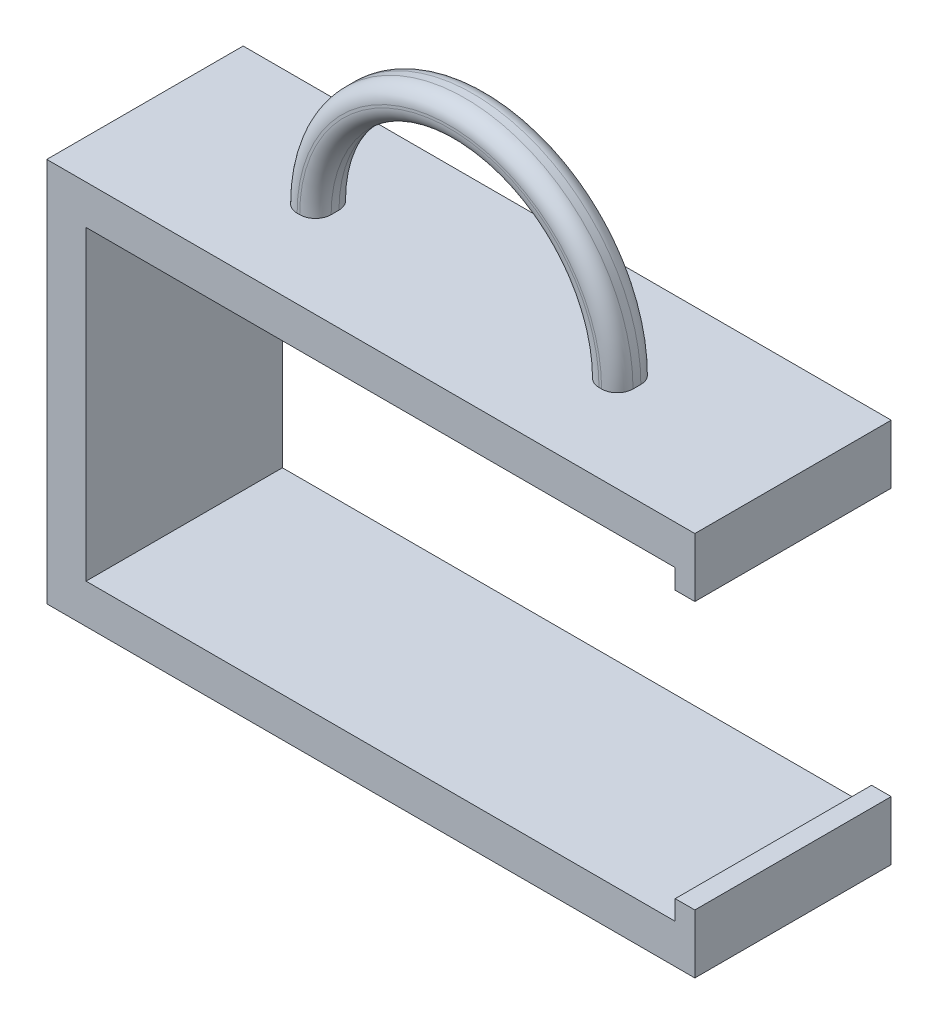
ISO-10303-21;
HEADER;
FILE_DESCRIPTION(('STEP AP214'),'2;1');
FILE_NAME('part.step','',(''),(''),'','','');
FILE_SCHEMA(('AUTOMOTIVE_DESIGN { 1 0 10303 214 1 1 1 1 }'));
ENDSEC;
DATA;
#1=APPLICATION_CONTEXT('core data for automotive mechanical design processes');
#2=APPLICATION_PROTOCOL_DEFINITION('international standard','automotive_design',2000,#1);
#3=PRODUCT_CONTEXT('',#1,'mechanical');
#4=PRODUCT('Part','Part','',(#3));
#5=PRODUCT_RELATED_PRODUCT_CATEGORY('part','',(#4));
#6=PRODUCT_DEFINITION_FORMATION('','',#4);
#7=PRODUCT_DEFINITION_CONTEXT('part definition',#1,'design');
#8=PRODUCT_DEFINITION('design','',#6,#7);
#9=PRODUCT_DEFINITION_SHAPE('','',#8);
#10=(LENGTH_UNIT() NAMED_UNIT(*) SI_UNIT(.MILLI.,.METRE.));
#11=(NAMED_UNIT(*) PLANE_ANGLE_UNIT() SI_UNIT($,.RADIAN.));
#12=(NAMED_UNIT(*) SI_UNIT($,.STERADIAN.) SOLID_ANGLE_UNIT());
#13=UNCERTAINTY_MEASURE_WITH_UNIT(LENGTH_MEASURE(1.E-05),#10,'distance_accuracy_value','');
#14=(GEOMETRIC_REPRESENTATION_CONTEXT(3) GLOBAL_UNCERTAINTY_ASSIGNED_CONTEXT((#13)) GLOBAL_UNIT_ASSIGNED_CONTEXT((#10,
#11,#12)) REPRESENTATION_CONTEXT('',''));
#15=CARTESIAN_POINT('',(0.,0.,0.));
#16=DIRECTION('',(0.,0.,1.));
#17=DIRECTION('',(1.,0.,0.));
#18=AXIS2_PLACEMENT_3D('',#15,#16,#17);
#19=CARTESIAN_POINT('',(41.25,5.,12.5));
#20=DIRECTION('',(-1.,0.,0.));
#21=DIRECTION('',(0.,0.,1.));
#22=AXIS2_PLACEMENT_3D('',#19,#20,#21);
#23=PLANE('',#22);
#24=DIRECTION('',(0.,-1.,0.));
#25=VECTOR('',#24,1.);
#26=CARTESIAN_POINT('',(41.25,5.,-12.5));
#27=LINE('',#26,#25);
#28=CARTESIAN_POINT('',(41.25,7.50000000000001,-12.5));
#29=VERTEX_POINT('',#28);
#30=CARTESIAN_POINT('',(41.25,0.,-12.5));
#31=VERTEX_POINT('',#30);
#32=EDGE_CURVE('E206',#29,#31,#27,.T.);
#33=ORIENTED_EDGE('',*,*,#32,.F.);
#34=DIRECTION('',(0.,0.,1.));
#35=VECTOR('',#34,1.);
#36=CARTESIAN_POINT('',(41.25,7.50000000000001,-46.8656805548792));
#37=LINE('',#36,#35);
#38=CARTESIAN_POINT('',(41.25,7.50000000000001,12.5));
#39=VERTEX_POINT('',#38);
#40=EDGE_CURVE('E198',#29,#39,#37,.T.);
#41=ORIENTED_EDGE('',*,*,#40,.T.);
#42=DIRECTION('',(0.,-1.,0.));
#43=VECTOR('',#42,1.);
#44=CARTESIAN_POINT('',(41.25,5.,12.5));
#45=LINE('',#44,#43);
#46=CARTESIAN_POINT('',(41.25,0.,12.5));
#47=VERTEX_POINT('',#46);
#48=EDGE_CURVE('E353',#39,#47,#45,.T.);
#49=ORIENTED_EDGE('',*,*,#48,.T.);
#50=DIRECTION('',(0.,0.,-1.));
#51=VECTOR('',#50,1.);
#52=CARTESIAN_POINT('',(41.25,0.,12.5));
#53=LINE('',#52,#51);
#54=EDGE_CURVE('E344',#47,#31,#53,.T.);
#55=ORIENTED_EDGE('',*,*,#54,.T.);
#56=EDGE_LOOP('',(#33,#41,#49,#55));
#57=FACE_BOUND('',#56,.T.);
#58=ADVANCED_FACE('F39',(#57),#23,.F.);
#59=CARTESIAN_POINT('',(38.75,5.,-51.5800460593383));
#60=DIRECTION('',(-1.,0.,0.));
#61=DIRECTION('',(0.,-1.,0.));
#62=AXIS2_PLACEMENT_3D('',#59,#60,#61);
#63=PLANE('',#62);
#64=DIRECTION('',(0.,0.,1.));
#65=VECTOR('',#64,1.);
#66=CARTESIAN_POINT('',(38.75,7.50000000000001,-51.5800460593383));
#67=LINE('',#66,#65);
#68=CARTESIAN_POINT('',(38.75,7.50000000000001,-12.5));
#69=VERTEX_POINT('',#68);
#70=CARTESIAN_POINT('',(38.75,7.50000000000001,12.5));
#71=VERTEX_POINT('',#70);
#72=EDGE_CURVE('E210',#69,#71,#67,.T.);
#73=ORIENTED_EDGE('',*,*,#72,.F.);
#74=DIRECTION('',(0.,1.,0.));
#75=VECTOR('',#74,1.);
#76=CARTESIAN_POINT('',(38.75,5.,-12.5));
#77=LINE('',#76,#75);
#78=CARTESIAN_POINT('',(38.75,5.,-12.5));
#79=VERTEX_POINT('',#78);
#80=EDGE_CURVE('E299',#79,#69,#77,.T.);
#81=ORIENTED_EDGE('',*,*,#80,.F.);
#82=DIRECTION('',(0.,0.,1.));
#83=VECTOR('',#82,1.);
#84=CARTESIAN_POINT('',(38.75,5.,-51.5800460593383));
#85=LINE('',#84,#83);
#86=CARTESIAN_POINT('',(38.75,5.,12.5));
#87=VERTEX_POINT('',#86);
#88=EDGE_CURVE('E412',#79,#87,#85,.T.);
#89=ORIENTED_EDGE('',*,*,#88,.T.);
#90=DIRECTION('',(0.,-1.,0.));
#91=VECTOR('',#90,1.);
#92=CARTESIAN_POINT('',(38.75,5.,12.5));
#93=LINE('',#92,#91);
#94=EDGE_CURVE('E403',#71,#87,#93,.T.);
#95=ORIENTED_EDGE('',*,*,#94,.F.);
#96=EDGE_LOOP('',(#73,#81,#89,#95));
#97=FACE_BOUND('',#96,.T.);
#98=ADVANCED_FACE('F435',(#97),#63,.T.);
#99=CARTESIAN_POINT('',(0.,5.,0.));
#100=DIRECTION('',(0.,-1.,0.));
#101=DIRECTION('',(0.,0.,-1.));
#102=AXIS2_PLACEMENT_3D('',#99,#100,#101);
#103=PLANE('',#102);
#104=DIRECTION('',(1.,0.,0.));
#105=VECTOR('',#104,1.);
#106=CARTESIAN_POINT('',(-41.25,5.,12.5));
#107=LINE('',#106,#105);
#108=CARTESIAN_POINT('',(-36.25,5.,12.5));
#109=VERTEX_POINT('',#108);
#110=EDGE_CURVE('E348',#109,#87,#107,.T.);
#111=ORIENTED_EDGE('',*,*,#110,.T.);
#112=ORIENTED_EDGE('',*,*,#88,.F.);
#113=DIRECTION('',(-1.,0.,0.));
#114=VECTOR('',#113,1.);
#115=CARTESIAN_POINT('',(-41.25,5.,-12.5));
#116=LINE('',#115,#114);
#117=CARTESIAN_POINT('',(-36.25,5.,-12.5));
#118=VERTEX_POINT('',#117);
#119=EDGE_CURVE('E345',#79,#118,#116,.T.);
#120=ORIENTED_EDGE('',*,*,#119,.T.);
#121=DIRECTION('',(0.,0.,-1.));
#122=VECTOR('',#121,1.);
#123=CARTESIAN_POINT('',(-36.25,5.,-12.5));
#124=LINE('',#123,#122);
#125=EDGE_CURVE('E323',#109,#118,#124,.T.);
#126=ORIENTED_EDGE('',*,*,#125,.F.);
#127=EDGE_LOOP('',(#111,#112,#120,#126));
#128=FACE_BOUND('',#127,.T.);
#129=ADVANCED_FACE('F446',(#128),#103,.F.);
#130=CARTESIAN_POINT('',(41.25,49.,12.5));
#131=VERTEX_POINT('',#130);
#132=CARTESIAN_POINT('',(41.25,41.5,12.5));
#133=VERTEX_POINT('',#132);
#134=EDGE_CURVE('E196',#131,#133,#45,.T.);
#135=ORIENTED_EDGE('',*,*,#134,.T.);
#136=DIRECTION('',(0.,0.,1.));
#137=VECTOR('',#136,1.);
#138=CARTESIAN_POINT('',(41.25,41.5,-46.8656805548792));
#139=LINE('',#138,#137);
#140=CARTESIAN_POINT('',(41.25,41.5,-12.5));
#141=VERTEX_POINT('',#140);
#142=EDGE_CURVE('E179',#141,#133,#139,.T.);
#143=ORIENTED_EDGE('',*,*,#142,.F.);
#144=CARTESIAN_POINT('',(41.25,49.,-12.5));
#145=VERTEX_POINT('',#144);
#146=EDGE_CURVE('E194',#145,#141,#27,.T.);
#147=ORIENTED_EDGE('',*,*,#146,.F.);
#148=DIRECTION('',(0.,0.,-1.));
#149=VECTOR('',#148,1.);
#150=CARTESIAN_POINT('',(41.25,49.,-12.5));
#151=LINE('',#150,#149);
#152=EDGE_CURVE('E309',#131,#145,#151,.T.);
#153=ORIENTED_EDGE('',*,*,#152,.F.);
#154=EDGE_LOOP('',(#135,#143,#147,#153));
#155=FACE_BOUND('',#154,.T.);
#156=ADVANCED_FACE('F192',(#155),#23,.F.);
#157=CARTESIAN_POINT('',(-41.25,5.,-12.5));
#158=DIRECTION('',(0.,0.,1.));
#159=DIRECTION('',(1.,0.,0.));
#160=AXIS2_PLACEMENT_3D('',#157,#158,#159);
#161=PLANE('',#160);
#162=ORIENTED_EDGE('',*,*,#80,.T.);
#163=DIRECTION('',(-1.,0.,0.));
#164=VECTOR('',#163,1.);
#165=CARTESIAN_POINT('',(36.25,7.50000000000001,-12.5));
#166=LINE('',#165,#164);
#167=EDGE_CURVE('E188',#29,#69,#166,.T.);
#168=ORIENTED_EDGE('',*,*,#167,.F.);
#169=ORIENTED_EDGE('',*,*,#32,.T.);
#170=DIRECTION('',(-1.,0.,0.));
#171=VECTOR('',#170,1.);
#172=CARTESIAN_POINT('',(-41.25,0.,-12.5));
#173=LINE('',#172,#171);
#174=CARTESIAN_POINT('',(-41.25,0.,-12.5));
#175=VERTEX_POINT('',#174);
#176=EDGE_CURVE('E357',#31,#175,#173,.T.);
#177=ORIENTED_EDGE('',*,*,#176,.T.);
#178=DIRECTION('',(0.,-1.,0.));
#179=VECTOR('',#178,1.);
#180=CARTESIAN_POINT('',(-41.25,5.,-12.5));
#181=LINE('',#180,#179);
#182=CARTESIAN_POINT('',(-41.25,49.,-12.5));
#183=VERTEX_POINT('',#182);
#184=EDGE_CURVE('E212',#183,#175,#181,.T.);
#185=ORIENTED_EDGE('',*,*,#184,.F.);
#186=DIRECTION('',(-1.,0.,0.));
#187=VECTOR('',#186,1.);
#188=CARTESIAN_POINT('',(41.25,49.,-12.5));
#189=LINE('',#188,#187);
#190=EDGE_CURVE('E203',#145,#183,#189,.T.);
#191=ORIENTED_EDGE('',*,*,#190,.F.);
#192=ORIENTED_EDGE('',*,*,#146,.T.);
#193=DIRECTION('',(1.,0.,0.));
#194=VECTOR('',#193,1.);
#195=CARTESIAN_POINT('',(36.25,41.5,-12.5));
#196=LINE('',#195,#194);
#197=CARTESIAN_POINT('',(38.75,41.5,-12.5));
#198=VERTEX_POINT('',#197);
#199=EDGE_CURVE('E176',#198,#141,#196,.T.);
#200=ORIENTED_EDGE('',*,*,#199,.F.);
#201=CARTESIAN_POINT('',(38.75,44.,-12.5));
#202=VERTEX_POINT('',#201);
#203=EDGE_CURVE('E406',#198,#202,#77,.T.);
#204=ORIENTED_EDGE('',*,*,#203,.T.);
#205=DIRECTION('',(-1.,0.,0.));
#206=VECTOR('',#205,1.);
#207=CARTESIAN_POINT('',(41.25,44.,-12.5));
#208=LINE('',#207,#206);
#209=CARTESIAN_POINT('',(-36.25,44.,-12.5));
#210=VERTEX_POINT('',#209);
#211=EDGE_CURVE('E278',#202,#210,#208,.T.);
#212=ORIENTED_EDGE('',*,*,#211,.T.);
#213=DIRECTION('',(0.,-1.,0.));
#214=VECTOR('',#213,1.);
#215=CARTESIAN_POINT('',(-36.25,44.,-12.5));
#216=LINE('',#215,#214);
#217=EDGE_CURVE('E333',#210,#118,#216,.T.);
#218=ORIENTED_EDGE('',*,*,#217,.T.);
#219=ORIENTED_EDGE('',*,*,#119,.F.);
#220=EDGE_LOOP('',(#162,#168,#169,#177,#185,#191,#192,#200,#204,#212,#218,#219));
#221=FACE_BOUND('',#220,.T.);
#222=ADVANCED_FACE('F201',(#221),#161,.F.);
#223=CARTESIAN_POINT('',(-41.25,5.,12.5));
#224=DIRECTION('',(1.,0.,0.));
#225=DIRECTION('',(0.,0.,-1.));
#226=AXIS2_PLACEMENT_3D('',#223,#224,#225);
#227=PLANE('',#226);
#228=DIRECTION('',(0.,0.,1.));
#229=VECTOR('',#228,1.);
#230=CARTESIAN_POINT('',(-41.25,0.,12.5));
#231=LINE('',#230,#229);
#232=CARTESIAN_POINT('',(-41.25,0.,12.5));
#233=VERTEX_POINT('',#232);
#234=EDGE_CURVE('E360',#175,#233,#231,.T.);
#235=ORIENTED_EDGE('',*,*,#234,.T.);
#236=DIRECTION('',(0.,-1.,0.));
#237=VECTOR('',#236,1.);
#238=CARTESIAN_POINT('',(-41.25,5.,12.5));
#239=LINE('',#238,#237);
#240=CARTESIAN_POINT('',(-41.25,49.,12.5));
#241=VERTEX_POINT('',#240);
#242=EDGE_CURVE('E367',#241,#233,#239,.T.);
#243=ORIENTED_EDGE('',*,*,#242,.F.);
#244=DIRECTION('',(0.,0.,1.));
#245=VECTOR('',#244,1.);
#246=CARTESIAN_POINT('',(-41.25,49.,-12.5));
#247=LINE('',#246,#245);
#248=EDGE_CURVE('E315',#183,#241,#247,.T.);
#249=ORIENTED_EDGE('',*,*,#248,.F.);
#250=ORIENTED_EDGE('',*,*,#184,.T.);
#251=EDGE_LOOP('',(#235,#243,#249,#250));
#252=FACE_BOUND('',#251,.T.);
#253=ADVANCED_FACE('F378',(#252),#227,.F.);
#254=CARTESIAN_POINT('',(-41.25,5.,12.5));
#255=DIRECTION('',(0.,0.,-1.));
#256=DIRECTION('',(-1.,0.,0.));
#257=AXIS2_PLACEMENT_3D('',#254,#255,#256);
#258=PLANE('',#257);
#259=ORIENTED_EDGE('',*,*,#48,.F.);
#260=DIRECTION('',(-1.,0.,0.));
#261=VECTOR('',#260,1.);
#262=CARTESIAN_POINT('',(-41.25,7.50000000000001,12.5));
#263=LINE('',#262,#261);
#264=EDGE_CURVE('E386',#39,#71,#263,.T.);
#265=ORIENTED_EDGE('',*,*,#264,.T.);
#266=ORIENTED_EDGE('',*,*,#94,.T.);
#267=ORIENTED_EDGE('',*,*,#110,.F.);
#268=DIRECTION('',(0.,-1.,0.));
#269=VECTOR('',#268,1.);
#270=CARTESIAN_POINT('',(-36.25,44.,12.5));
#271=LINE('',#270,#269);
#272=CARTESIAN_POINT('',(-36.25,44.,12.5));
#273=VERTEX_POINT('',#272);
#274=EDGE_CURVE('E340',#273,#109,#271,.T.);
#275=ORIENTED_EDGE('',*,*,#274,.F.);
#276=DIRECTION('',(1.,0.,0.));
#277=VECTOR('',#276,1.);
#278=CARTESIAN_POINT('',(41.25,44.,12.5));
#279=LINE('',#278,#277);
#280=CARTESIAN_POINT('',(38.75,44.,12.5));
#281=VERTEX_POINT('',#280);
#282=EDGE_CURVE('E312',#273,#281,#279,.T.);
#283=ORIENTED_EDGE('',*,*,#282,.T.);
#284=CARTESIAN_POINT('',(38.75,41.5,12.5));
#285=VERTEX_POINT('',#284);
#286=EDGE_CURVE('E407',#281,#285,#93,.T.);
#287=ORIENTED_EDGE('',*,*,#286,.T.);
#288=DIRECTION('',(1.,0.,0.));
#289=VECTOR('',#288,1.);
#290=CARTESIAN_POINT('',(-41.25,41.5,12.5));
#291=LINE('',#290,#289);
#292=EDGE_CURVE('E187',#285,#133,#291,.T.);
#293=ORIENTED_EDGE('',*,*,#292,.T.);
#294=ORIENTED_EDGE('',*,*,#134,.F.);
#295=DIRECTION('',(1.,0.,0.));
#296=VECTOR('',#295,1.);
#297=CARTESIAN_POINT('',(41.25,49.,12.5));
#298=LINE('',#297,#296);
#299=EDGE_CURVE('E319',#241,#131,#298,.T.);
#300=ORIENTED_EDGE('',*,*,#299,.F.);
#301=ORIENTED_EDGE('',*,*,#242,.T.);
#302=DIRECTION('',(1.,0.,0.));
#303=VECTOR('',#302,1.);
#304=CARTESIAN_POINT('',(-41.25,0.,12.5));
#305=LINE('',#304,#303);
#306=EDGE_CURVE('E349',#233,#47,#305,.T.);
#307=ORIENTED_EDGE('',*,*,#306,.T.);
#308=EDGE_LOOP('',(#259,#265,#266,#267,#275,#283,#287,#293,#294,#300,#301,#307));
#309=FACE_BOUND('',#308,.T.);
#310=ADVANCED_FACE('F384',(#309),#258,.F.);
#311=CARTESIAN_POINT('',(0.,0.,0.));
#312=DIRECTION('',(0.,-1.,0.));
#313=DIRECTION('',(0.,0.,-1.));
#314=AXIS2_PLACEMENT_3D('',#311,#312,#313);
#315=PLANE('',#314);
#316=ORIENTED_EDGE('',*,*,#54,.F.);
#317=ORIENTED_EDGE('',*,*,#306,.F.);
#318=ORIENTED_EDGE('',*,*,#234,.F.);
#319=ORIENTED_EDGE('',*,*,#176,.F.);
#320=EDGE_LOOP('',(#316,#317,#318,#319));
#321=FACE_BOUND('',#320,.T.);
#322=ADVANCED_FACE('F382',(#321),#315,.T.);
#323=CARTESIAN_POINT('',(-36.25,44.,-12.5));
#324=DIRECTION('',(-1.,0.,0.));
#325=DIRECTION('',(0.,0.,1.));
#326=AXIS2_PLACEMENT_3D('',#323,#324,#325);
#327=PLANE('',#326);
#328=ORIENTED_EDGE('',*,*,#125,.T.);
#329=ORIENTED_EDGE('',*,*,#217,.F.);
#330=DIRECTION('',(0.,0.,-1.));
#331=VECTOR('',#330,1.);
#332=CARTESIAN_POINT('',(-36.25,44.,-12.5));
#333=LINE('',#332,#331);
#334=EDGE_CURVE('E329',#273,#210,#333,.T.);
#335=ORIENTED_EDGE('',*,*,#334,.F.);
#336=ORIENTED_EDGE('',*,*,#274,.T.);
#337=EDGE_LOOP('',(#328,#329,#335,#336));
#338=FACE_BOUND('',#337,.T.);
#339=ADVANCED_FACE('F427',(#338),#327,.F.);
#340=CARTESIAN_POINT('',(0.,49.,0.));
#341=DIRECTION('',(0.,-1.,0.));
#342=DIRECTION('',(0.,0.,-1.));
#343=AXIS2_PLACEMENT_3D('',#340,#341,#342);
#344=PLANE('',#343);
#345=DIRECTION('',(0.,0.,-1.));
#346=VECTOR('',#345,1.);
#347=CARTESIAN_POINT('',(21.3818688638832,49.,2.5));
#348=LINE('',#347,#346);
#349=CARTESIAN_POINT('',(21.3818688638832,49.,0.5));
#350=VERTEX_POINT('',#349);
#351=CARTESIAN_POINT('',(21.3818688638832,49.,-0.5));
#352=VERTEX_POINT('',#351);
#353=EDGE_CURVE('E279',#350,#352,#348,.T.);
#354=ORIENTED_EDGE('',*,*,#353,.F.);
#355=CARTESIAN_POINT('',(19.3818688638832,49.,0.5));
#356=DIRECTION('',(0.,-1.,0.));
#357=DIRECTION('',(0.,0.,-1.));
#358=AXIS2_PLACEMENT_3D('',#355,#356,#357);
#359=CIRCLE('',#358,2.);
#360=CARTESIAN_POINT('',(19.3818688638832,49.,2.5));
#361=VERTEX_POINT('',#360);
#362=EDGE_CURVE('E242',#350,#361,#359,.T.);
#363=ORIENTED_EDGE('',*,*,#362,.T.);
#364=DIRECTION('',(1.,0.,0.));
#365=VECTOR('',#364,1.);
#366=CARTESIAN_POINT('',(17.053024247269,49.,2.5));
#367=LINE('',#366,#365);
#368=CARTESIAN_POINT('',(19.053024247269,49.,2.5));
#369=VERTEX_POINT('',#368);
#370=EDGE_CURVE('E272',#369,#361,#367,.T.);
#371=ORIENTED_EDGE('',*,*,#370,.F.);
#372=CARTESIAN_POINT('',(19.053024247269,49.,0.5));
#373=DIRECTION('',(0.,-1.,0.));
#374=DIRECTION('',(0.,0.,-1.));
#375=AXIS2_PLACEMENT_3D('',#372,#373,#374);
#376=CIRCLE('',#375,2.);
#377=CARTESIAN_POINT('',(17.053024247269,49.,0.5));
#378=VERTEX_POINT('',#377);
#379=EDGE_CURVE('E48',#369,#378,#376,.T.);
#380=ORIENTED_EDGE('',*,*,#379,.T.);
#381=DIRECTION('',(0.,0.,-1.));
#382=VECTOR('',#381,1.);
#383=CARTESIAN_POINT('',(17.053024247269,49.,2.5));
#384=LINE('',#383,#382);
#385=CARTESIAN_POINT('',(17.053024247269,49.,-0.5));
#386=VERTEX_POINT('',#385);
#387=EDGE_CURVE('E271',#378,#386,#384,.T.);
#388=ORIENTED_EDGE('',*,*,#387,.T.);
#389=CARTESIAN_POINT('',(19.053024247269,49.,-0.5));
#390=DIRECTION('',(0.,-1.,0.));
#391=DIRECTION('',(0.,0.,-1.));
#392=AXIS2_PLACEMENT_3D('',#389,#390,#391);
#393=CIRCLE('',#392,2.);
#394=CARTESIAN_POINT('',(19.053024247269,49.,-2.5));
#395=VERTEX_POINT('',#394);
#396=EDGE_CURVE('E259',#386,#395,#393,.T.);
#397=ORIENTED_EDGE('',*,*,#396,.T.);
#398=DIRECTION('',(1.,0.,0.));
#399=VECTOR('',#398,1.);
#400=CARTESIAN_POINT('',(17.053024247269,49.,-2.5));
#401=LINE('',#400,#399);
#402=CARTESIAN_POINT('',(19.3818688638832,49.,-2.5));
#403=VERTEX_POINT('',#402);
#404=EDGE_CURVE('E296',#395,#403,#401,.T.);
#405=ORIENTED_EDGE('',*,*,#404,.T.);
#406=CARTESIAN_POINT('',(19.3818688638832,49.,-0.5));
#407=DIRECTION('',(0.,-1.,0.));
#408=DIRECTION('',(0.,0.,-1.));
#409=AXIS2_PLACEMENT_3D('',#406,#407,#408);
#410=CIRCLE('',#409,2.);
#411=EDGE_CURVE('E236',#403,#352,#410,.T.);
#412=ORIENTED_EDGE('',*,*,#411,.T.);
#413=EDGE_LOOP('',(#354,#363,#371,#380,#388,#397,#405,#412));
#414=FACE_BOUND('',#413,.T.);
#415=DIRECTION('',(0.,0.,-1.));
#416=VECTOR('',#415,1.);
#417=CARTESIAN_POINT('',(-17.053024247269,49.,2.5));
#418=LINE('',#417,#416);
#419=CARTESIAN_POINT('',(-17.053024247269,49.,0.5));
#420=VERTEX_POINT('',#419);
#421=CARTESIAN_POINT('',(-17.053024247269,49.,-0.5));
#422=VERTEX_POINT('',#421);
#423=EDGE_CURVE('E286',#420,#422,#418,.T.);
#424=ORIENTED_EDGE('',*,*,#423,.F.);
#425=CARTESIAN_POINT('',(-19.053024247269,49.,0.5));
#426=DIRECTION('',(0.,-1.,0.));
#427=DIRECTION('',(0.,0.,-1.));
#428=AXIS2_PLACEMENT_3D('',#425,#426,#427);
#429=CIRCLE('',#428,2.);
#430=CARTESIAN_POINT('',(-19.053024247269,49.,2.5));
#431=VERTEX_POINT('',#430);
#432=EDGE_CURVE('E11',#420,#431,#429,.T.);
#433=ORIENTED_EDGE('',*,*,#432,.T.);
#434=DIRECTION('',(1.,0.,0.));
#435=VECTOR('',#434,1.);
#436=CARTESIAN_POINT('',(-17.053024247269,49.,2.5));
#437=LINE('',#436,#435);
#438=CARTESIAN_POINT('',(-19.3818688638832,49.,2.5));
#439=VERTEX_POINT('',#438);
#440=EDGE_CURVE('E283',#439,#431,#437,.T.);
#441=ORIENTED_EDGE('',*,*,#440,.F.);
#442=CARTESIAN_POINT('',(-19.3818688638832,49.,0.5));
#443=DIRECTION('',(0.,-1.,0.));
#444=DIRECTION('',(0.,0.,-1.));
#445=AXIS2_PLACEMENT_3D('',#442,#443,#444);
#446=CIRCLE('',#445,2.);
#447=CARTESIAN_POINT('',(-21.3818688638832,49.,0.5));
#448=VERTEX_POINT('',#447);
#449=EDGE_CURVE('E239',#439,#448,#446,.T.);
#450=ORIENTED_EDGE('',*,*,#449,.T.);
#451=DIRECTION('',(0.,0.,-1.));
#452=VECTOR('',#451,1.);
#453=CARTESIAN_POINT('',(-21.3818688638832,49.,2.5));
#454=LINE('',#453,#452);
#455=CARTESIAN_POINT('',(-21.3818688638832,49.,-0.5));
#456=VERTEX_POINT('',#455);
#457=EDGE_CURVE('E290',#448,#456,#454,.T.);
#458=ORIENTED_EDGE('',*,*,#457,.T.);
#459=CARTESIAN_POINT('',(-19.3818688638832,49.,-0.5));
#460=DIRECTION('',(0.,-1.,0.));
#461=DIRECTION('',(0.,0.,-1.));
#462=AXIS2_PLACEMENT_3D('',#459,#460,#461);
#463=CIRCLE('',#462,2.);
#464=CARTESIAN_POINT('',(-19.3818688638832,49.,-2.5));
#465=VERTEX_POINT('',#464);
#466=EDGE_CURVE('E233',#456,#465,#463,.T.);
#467=ORIENTED_EDGE('',*,*,#466,.T.);
#468=DIRECTION('',(1.,0.,0.));
#469=VECTOR('',#468,1.);
#470=CARTESIAN_POINT('',(-17.053024247269,49.,-2.5));
#471=LINE('',#470,#469);
#472=CARTESIAN_POINT('',(-19.053024247269,49.,-2.5));
#473=VERTEX_POINT('',#472);
#474=EDGE_CURVE('E292',#465,#473,#471,.T.);
#475=ORIENTED_EDGE('',*,*,#474,.T.);
#476=CARTESIAN_POINT('',(-19.053024247269,49.,-0.5));
#477=DIRECTION('',(0.,-1.,0.));
#478=DIRECTION('',(0.,0.,-1.));
#479=AXIS2_PLACEMENT_3D('',#476,#477,#478);
#480=CIRCLE('',#479,2.);
#481=EDGE_CURVE('E262',#473,#422,#480,.T.);
#482=ORIENTED_EDGE('',*,*,#481,.T.);
#483=EDGE_LOOP('',(#424,#433,#441,#450,#458,#467,#475,#482));
#484=FACE_BOUND('',#483,.T.);
#485=ORIENTED_EDGE('',*,*,#152,.T.);
#486=ORIENTED_EDGE('',*,*,#190,.T.);
#487=ORIENTED_EDGE('',*,*,#248,.T.);
#488=ORIENTED_EDGE('',*,*,#299,.T.);
#489=EDGE_LOOP('',(#485,#486,#487,#488));
#490=FACE_BOUND('',#489,.T.);
#491=ADVANCED_FACE('F270',(#414,#484,#490),#344,.F.);
#492=CARTESIAN_POINT('',(0.,44.,0.));
#493=DIRECTION('',(0.,-1.,0.));
#494=DIRECTION('',(0.,0.,-1.));
#495=AXIS2_PLACEMENT_3D('',#492,#493,#494);
#496=PLANE('',#495);
#497=DIRECTION('',(0.,0.,1.));
#498=VECTOR('',#497,1.);
#499=CARTESIAN_POINT('',(38.75,44.,-51.5800460593383));
#500=LINE('',#499,#498);
#501=EDGE_CURVE('E411',#202,#281,#500,.T.);
#502=ORIENTED_EDGE('',*,*,#501,.T.);
#503=ORIENTED_EDGE('',*,*,#282,.F.);
#504=ORIENTED_EDGE('',*,*,#334,.T.);
#505=ORIENTED_EDGE('',*,*,#211,.F.);
#506=EDGE_LOOP('',(#502,#503,#504,#505));
#507=FACE_BOUND('',#506,.T.);
#508=ADVANCED_FACE('F421',(#507),#496,.T.);
#509=CARTESIAN_POINT('',(0.,49.,2.5));
#510=DIRECTION('',(0.,0.,-1.));
#511=DIRECTION('',(-1.,0.,0.));
#512=AXIS2_PLACEMENT_3D('',#509,#510,#511);
#513=CYLINDRICAL_SURFACE('',#512,17.053024247269);
#514=ORIENTED_EDGE('',*,*,#423,.T.);
#515=CARTESIAN_POINT('',(0.,49.,-0.5));
#516=DIRECTION('',(0.,0.,1.));
#517=DIRECTION('',(1.,0.,0.));
#518=AXIS2_PLACEMENT_3D('',#515,#516,#517);
#519=CIRCLE('',#518,17.053024247269);
#520=EDGE_CURVE('E249',#422,#386,#519,.F.);
#521=ORIENTED_EDGE('',*,*,#520,.T.);
#522=ORIENTED_EDGE('',*,*,#387,.F.);
#523=CARTESIAN_POINT('',(0.,49.,0.5));
#524=DIRECTION('',(0.,0.,1.));
#525=DIRECTION('',(1.,0.,0.));
#526=AXIS2_PLACEMENT_3D('',#523,#524,#525);
#527=CIRCLE('',#526,17.053024247269);
#528=EDGE_CURVE('E246',#378,#420,#527,.T.);
#529=ORIENTED_EDGE('',*,*,#528,.T.);
#530=EDGE_LOOP('',(#514,#521,#522,#529));
#531=FACE_BOUND('',#530,.T.);
#532=ADVANCED_FACE('F275',(#531),#513,.F.);
#533=CARTESIAN_POINT('',(0.,49.,2.5));
#534=DIRECTION('',(0.,0.,-1.));
#535=DIRECTION('',(-1.,0.,0.));
#536=AXIS2_PLACEMENT_3D('',#533,#534,#535);
#537=CYLINDRICAL_SURFACE('',#536,21.3818688638832);
#538=ORIENTED_EDGE('',*,*,#353,.T.);
#539=CARTESIAN_POINT('',(0.,49.,-0.5));
#540=DIRECTION('',(0.,0.,1.));
#541=DIRECTION('',(1.,0.,0.));
#542=AXIS2_PLACEMENT_3D('',#539,#540,#541);
#543=CIRCLE('',#542,21.3818688638832);
#544=EDGE_CURVE('E221',#352,#456,#543,.T.);
#545=ORIENTED_EDGE('',*,*,#544,.T.);
#546=ORIENTED_EDGE('',*,*,#457,.F.);
#547=CARTESIAN_POINT('',(0.,49.,0.5));
#548=DIRECTION('',(0.,0.,1.));
#549=DIRECTION('',(1.,0.,0.));
#550=AXIS2_PLACEMENT_3D('',#547,#548,#549);
#551=CIRCLE('',#550,21.3818688638832);
#552=EDGE_CURVE('E218',#448,#350,#551,.F.);
#553=ORIENTED_EDGE('',*,*,#552,.T.);
#554=EDGE_LOOP('',(#538,#545,#546,#553));
#555=FACE_BOUND('',#554,.T.);
#556=ADVANCED_FACE('F506',(#555),#537,.T.);
#557=CARTESIAN_POINT('',(0.,49.,2.5));
#558=DIRECTION('',(0.,0.,1.));
#559=DIRECTION('',(1.,0.,0.));
#560=AXIS2_PLACEMENT_3D('',#557,#558,#559);
#561=PLANE('',#560);
#562=ORIENTED_EDGE('',*,*,#440,.T.);
#563=CARTESIAN_POINT('',(0.,49.,2.5));
#564=DIRECTION('',(0.,0.,1.));
#565=DIRECTION('',(1.,0.,0.));
#566=AXIS2_PLACEMENT_3D('',#563,#564,#565);
#567=CIRCLE('',#566,19.053024247269);
#568=EDGE_CURVE('E256',#431,#369,#567,.F.);
#569=ORIENTED_EDGE('',*,*,#568,.T.);
#570=ORIENTED_EDGE('',*,*,#370,.T.);
#571=CARTESIAN_POINT('',(0.,49.,2.5));
#572=DIRECTION('',(0.,0.,1.));
#573=DIRECTION('',(1.,0.,0.));
#574=AXIS2_PLACEMENT_3D('',#571,#572,#573);
#575=CIRCLE('',#574,19.3818688638832);
#576=EDGE_CURVE('E229',#361,#439,#575,.T.);
#577=ORIENTED_EDGE('',*,*,#576,.T.);
#578=EDGE_LOOP('',(#562,#569,#570,#577));
#579=FACE_BOUND('',#578,.T.);
#580=ADVANCED_FACE('F282',(#579),#561,.T.);
#581=CARTESIAN_POINT('',(0.,49.,-2.5));
#582=DIRECTION('',(0.,0.,1.));
#583=DIRECTION('',(1.,0.,0.));
#584=AXIS2_PLACEMENT_3D('',#581,#582,#583);
#585=PLANE('',#584);
#586=ORIENTED_EDGE('',*,*,#404,.F.);
#587=CARTESIAN_POINT('',(0.,49.,-2.5));
#588=DIRECTION('',(0.,0.,1.));
#589=DIRECTION('',(1.,0.,0.));
#590=AXIS2_PLACEMENT_3D('',#587,#588,#589);
#591=CIRCLE('',#590,19.053024247269);
#592=EDGE_CURVE('E253',#395,#473,#591,.T.);
#593=ORIENTED_EDGE('',*,*,#592,.T.);
#594=ORIENTED_EDGE('',*,*,#474,.F.);
#595=CARTESIAN_POINT('',(0.,49.,-2.5));
#596=DIRECTION('',(0.,0.,1.));
#597=DIRECTION('',(1.,0.,0.));
#598=AXIS2_PLACEMENT_3D('',#595,#596,#597);
#599=CIRCLE('',#598,19.3818688638832);
#600=EDGE_CURVE('E225',#465,#403,#599,.F.);
#601=ORIENTED_EDGE('',*,*,#600,.T.);
#602=EDGE_LOOP('',(#586,#593,#594,#601));
#603=FACE_BOUND('',#602,.T.);
#604=ADVANCED_FACE('F433',(#603),#585,.F.);
#605=DIRECTION('',(0.,0.,-1.));
#606=VECTOR('',#605,1.);
#607=CARTESIAN_POINT('',(38.75,41.5,-51.5800460593383));
#608=LINE('',#607,#606);
#609=EDGE_CURVE('E182',#285,#198,#608,.T.);
#610=ORIENTED_EDGE('',*,*,#609,.F.);
#611=ORIENTED_EDGE('',*,*,#286,.F.);
#612=ORIENTED_EDGE('',*,*,#501,.F.);
#613=ORIENTED_EDGE('',*,*,#203,.F.);
#614=EDGE_LOOP('',(#610,#611,#612,#613));
#615=FACE_BOUND('',#614,.T.);
#616=ADVANCED_FACE('F431',(#615),#63,.T.);
#617=CARTESIAN_POINT('',(36.25,41.5,-46.8656805548792));
#618=DIRECTION('',(0.,1.,0.));
#619=DIRECTION('',(0.,0.,1.));
#620=AXIS2_PLACEMENT_3D('',#617,#618,#619);
#621=PLANE('',#620);
#622=ORIENTED_EDGE('',*,*,#609,.T.);
#623=ORIENTED_EDGE('',*,*,#199,.T.);
#624=ORIENTED_EDGE('',*,*,#142,.T.);
#625=ORIENTED_EDGE('',*,*,#292,.F.);
#626=EDGE_LOOP('',(#622,#623,#624,#625));
#627=FACE_BOUND('',#626,.T.);
#628=ADVANCED_FACE('F178',(#627),#621,.F.);
#629=CARTESIAN_POINT('',(36.25,7.50000000000001,-46.8656805548792));
#630=DIRECTION('',(0.,-1.,0.));
#631=DIRECTION('',(0.,0.,-1.));
#632=AXIS2_PLACEMENT_3D('',#629,#630,#631);
#633=PLANE('',#632);
#634=ORIENTED_EDGE('',*,*,#40,.F.);
#635=ORIENTED_EDGE('',*,*,#167,.T.);
#636=ORIENTED_EDGE('',*,*,#72,.T.);
#637=ORIENTED_EDGE('',*,*,#264,.F.);
#638=EDGE_LOOP('',(#634,#635,#636,#637));
#639=FACE_BOUND('',#638,.T.);
#640=ADVANCED_FACE('F440',(#639),#633,.F.);
#641=CARTESIAN_POINT('',(0.,49.,-0.5));
#642=DIRECTION('',(0.,0.,1.));
#643=DIRECTION('',(1.,0.,0.));
#644=AXIS2_PLACEMENT_3D('',#641,#642,#643);
#645=TOROIDAL_SURFACE('',#644,19.3818688638832,2.);
#646=ORIENTED_EDGE('',*,*,#411,.F.);
#647=ORIENTED_EDGE('',*,*,#600,.F.);
#648=ORIENTED_EDGE('',*,*,#466,.F.);
#649=ORIENTED_EDGE('',*,*,#544,.F.);
#650=EDGE_LOOP('',(#646,#647,#648,#649));
#651=FACE_BOUND('',#650,.T.);
#652=ADVANCED_FACE('F551',(#651),#645,.T.);
#653=CARTESIAN_POINT('',(0.,49.,0.5));
#654=DIRECTION('',(0.,0.,1.));
#655=DIRECTION('',(1.,0.,0.));
#656=AXIS2_PLACEMENT_3D('',#653,#654,#655);
#657=TOROIDAL_SURFACE('',#656,19.3818688638832,2.);
#658=ORIENTED_EDGE('',*,*,#362,.F.);
#659=ORIENTED_EDGE('',*,*,#552,.F.);
#660=ORIENTED_EDGE('',*,*,#449,.F.);
#661=ORIENTED_EDGE('',*,*,#576,.F.);
#662=EDGE_LOOP('',(#658,#659,#660,#661));
#663=FACE_BOUND('',#662,.T.);
#664=ADVANCED_FACE('F536',(#663),#657,.T.);
#665=CARTESIAN_POINT('',(0.,49.,-0.5));
#666=DIRECTION('',(0.,0.,1.));
#667=DIRECTION('',(1.,0.,0.));
#668=AXIS2_PLACEMENT_3D('',#665,#666,#667);
#669=TOROIDAL_SURFACE('',#668,19.053024247269,2.);
#670=ORIENTED_EDGE('',*,*,#481,.F.);
#671=ORIENTED_EDGE('',*,*,#592,.F.);
#672=ORIENTED_EDGE('',*,*,#396,.F.);
#673=ORIENTED_EDGE('',*,*,#520,.F.);
#674=EDGE_LOOP('',(#670,#671,#672,#673));
#675=FACE_BOUND('',#674,.T.);
#676=ADVANCED_FACE('F531',(#675),#669,.T.);
#677=CARTESIAN_POINT('',(0.,49.,0.5));
#678=DIRECTION('',(0.,0.,1.));
#679=DIRECTION('',(1.,0.,0.));
#680=AXIS2_PLACEMENT_3D('',#677,#678,#679);
#681=TOROIDAL_SURFACE('',#680,19.053024247269,2.);
#682=ORIENTED_EDGE('',*,*,#432,.F.);
#683=ORIENTED_EDGE('',*,*,#528,.F.);
#684=ORIENTED_EDGE('',*,*,#379,.F.);
#685=ORIENTED_EDGE('',*,*,#568,.F.);
#686=EDGE_LOOP('',(#682,#683,#684,#685));
#687=FACE_BOUND('',#686,.T.);
#688=ADVANCED_FACE('F41',(#687),#681,.T.);
#689=CLOSED_SHELL('',(#58,#98,#129,#156,#222,#253,#310,#322,#339,#491,#508,#532,#556,#580,#604,
#616,#628,#640,#652,#664,#676,#688));
#690=MANIFOLD_SOLID_BREP('B2',#689);
#691=ADVANCED_BREP_SHAPE_REPRESENTATION('',(#18,#690),#14);
#692=SHAPE_DEFINITION_REPRESENTATION(#9,#691);
ENDSEC;
END-ISO-10303-21;
